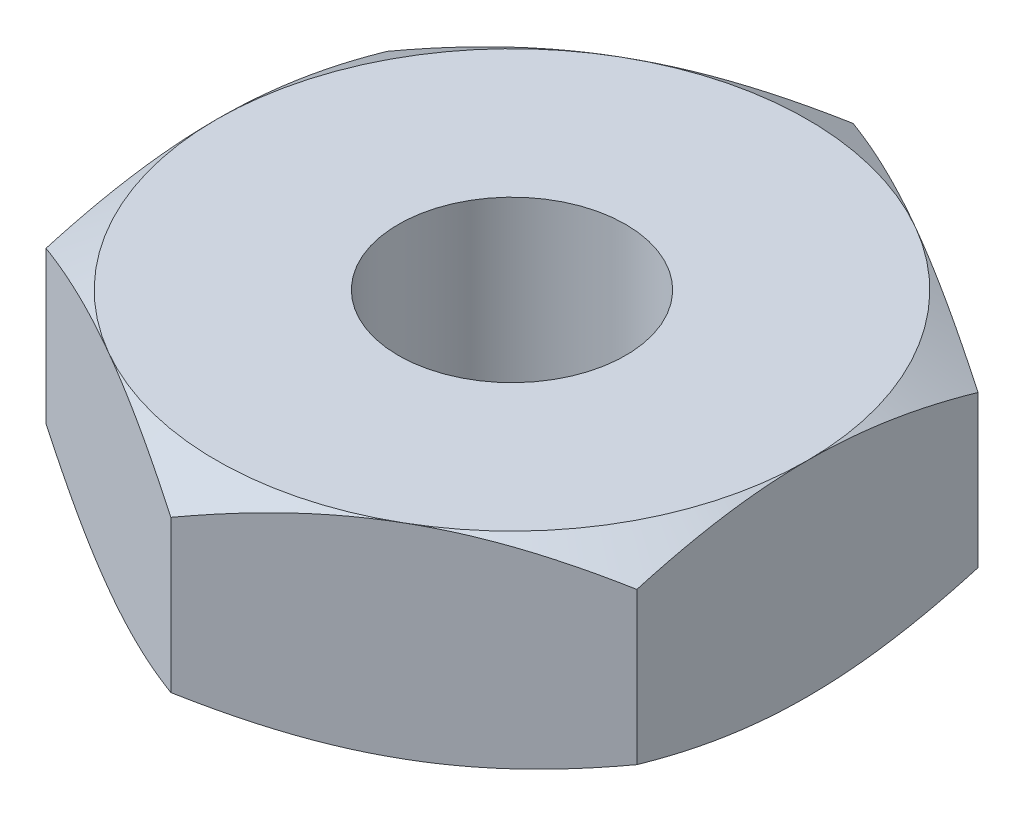
ISO-10303-21;
HEADER;
FILE_DESCRIPTION(('STEP AP214'),'2;1');
FILE_NAME('part.step','',(''),(''),'','','');
FILE_SCHEMA(('AUTOMOTIVE_DESIGN { 1 0 10303 214 1 1 1 1 }'));
ENDSEC;
DATA;
#1=APPLICATION_CONTEXT('core data for automotive mechanical design processes');
#2=APPLICATION_PROTOCOL_DEFINITION('international standard','automotive_design',2000,#1);
#3=PRODUCT_CONTEXT('',#1,'mechanical');
#4=PRODUCT('Part','Part','',(#3));
#5=PRODUCT_RELATED_PRODUCT_CATEGORY('part','',(#4));
#6=PRODUCT_DEFINITION_FORMATION('','',#4);
#7=PRODUCT_DEFINITION_CONTEXT('part definition',#1,'design');
#8=PRODUCT_DEFINITION('design','',#6,#7);
#9=PRODUCT_DEFINITION_SHAPE('','',#8);
#10=(LENGTH_UNIT() NAMED_UNIT(*) SI_UNIT(.MILLI.,.METRE.));
#11=(NAMED_UNIT(*) PLANE_ANGLE_UNIT() SI_UNIT($,.RADIAN.));
#12=(NAMED_UNIT(*) SI_UNIT($,.STERADIAN.) SOLID_ANGLE_UNIT());
#13=UNCERTAINTY_MEASURE_WITH_UNIT(LENGTH_MEASURE(1.E-05),#10,'distance_accuracy_value','');
#14=(GEOMETRIC_REPRESENTATION_CONTEXT(3) GLOBAL_UNCERTAINTY_ASSIGNED_CONTEXT((#13)) GLOBAL_UNIT_ASSIGNED_CONTEXT((#10,
#11,#12)) REPRESENTATION_CONTEXT('',''));
#15=CARTESIAN_POINT('',(0.,0.,0.));
#16=DIRECTION('',(0.,0.,1.));
#17=DIRECTION('',(1.,0.,0.));
#18=AXIS2_PLACEMENT_3D('',#15,#16,#17);
#19=CARTESIAN_POINT('',(0.,0.,0.));
#20=DIRECTION('',(0.,1.,0.));
#21=DIRECTION('',(0.,0.,1.));
#22=AXIS2_PLACEMENT_3D('',#19,#20,#21);
#23=PLANE('',#22);
#24=CARTESIAN_POINT('',(0.,0.,0.));
#25=DIRECTION('',(0.,1.,0.));
#26=DIRECTION('',(0.,0.,1.));
#27=AXIS2_PLACEMENT_3D('',#24,#25,#26);
#28=CIRCLE('',#27,0.625);
#29=CARTESIAN_POINT('',(0.,0.,0.625));
#30=VERTEX_POINT('',#29);
#31=EDGE_CURVE('E277',#30,#30,#28,.T.);
#32=ORIENTED_EDGE('',*,*,#31,.T.);
#33=EDGE_LOOP('',(#32));
#34=FACE_BOUND('',#33,.T.);
#35=CARTESIAN_POINT('',(0.,0.,0.));
#36=DIRECTION('',(0.,1.,0.));
#37=DIRECTION('',(0.,0.,1.));
#38=AXIS2_PLACEMENT_3D('',#35,#36,#37);
#39=CIRCLE('',#38,1.625);
#40=CARTESIAN_POINT('',(0.8125,0.,1.40729128114971));
#41=VERTEX_POINT('',#40);
#42=CARTESIAN_POINT('',(-0.8125,0.,1.40729128114971));
#43=VERTEX_POINT('',#42);
#44=EDGE_CURVE('E52',#41,#43,#39,.F.);
#45=ORIENTED_EDGE('',*,*,#44,.T.);
#46=CARTESIAN_POINT('',(-1.625,0.,0.));
#47=VERTEX_POINT('',#46);
#48=EDGE_CURVE('E12',#43,#47,#39,.F.);
#49=ORIENTED_EDGE('',*,*,#48,.T.);
#50=CARTESIAN_POINT('',(-0.8125,0.,-1.40729128114971));
#51=VERTEX_POINT('',#50);
#52=EDGE_CURVE('E58',#47,#51,#39,.F.);
#53=ORIENTED_EDGE('',*,*,#52,.T.);
#54=CARTESIAN_POINT('',(0.8125,0.,-1.40729128114971));
#55=VERTEX_POINT('',#54);
#56=EDGE_CURVE('E398',#51,#55,#39,.F.);
#57=ORIENTED_EDGE('',*,*,#56,.T.);
#58=CARTESIAN_POINT('',(1.625,0.,0.));
#59=VERTEX_POINT('',#58);
#60=EDGE_CURVE('E161',#55,#59,#39,.F.);
#61=ORIENTED_EDGE('',*,*,#60,.T.);
#62=CARTESIAN_POINT('',(0.,0.,0.));
#63=DIRECTION('',(0.,1.,0.));
#64=DIRECTION('',(0.,0.,1.));
#65=AXIS2_PLACEMENT_3D('',#62,#63,#64);
#66=CIRCLE('',#65,1.625);
#67=EDGE_CURVE('E142',#41,#59,#66,.T.);
#68=ORIENTED_EDGE('',*,*,#67,.F.);
#69=EDGE_LOOP('',(#45,#49,#53,#57,#61,#68));
#70=FACE_BOUND('',#69,.T.);
#71=ADVANCED_FACE('F47',(#34,#70),#23,.F.);
#72=CARTESIAN_POINT('',(0.,1.125,0.));
#73=DIRECTION('',(0.,1.,0.));
#74=DIRECTION('',(0.,0.,1.));
#75=AXIS2_PLACEMENT_3D('',#72,#73,#74);
#76=PLANE('',#75);
#77=CARTESIAN_POINT('',(0.,1.125,0.));
#78=DIRECTION('',(0.,1.,0.));
#79=DIRECTION('',(0.,0.,1.));
#80=AXIS2_PLACEMENT_3D('',#77,#78,#79);
#81=CIRCLE('',#80,0.625);
#82=CARTESIAN_POINT('',(0.,1.125,0.625));
#83=VERTEX_POINT('',#82);
#84=EDGE_CURVE('E272',#83,#83,#81,.T.);
#85=ORIENTED_EDGE('',*,*,#84,.F.);
#86=EDGE_LOOP('',(#85));
#87=FACE_BOUND('',#86,.T.);
#88=CARTESIAN_POINT('',(0.,1.125,0.));
#89=DIRECTION('',(0.,1.,0.));
#90=DIRECTION('',(0.,0.,1.));
#91=AXIS2_PLACEMENT_3D('',#88,#89,#90);
#92=CIRCLE('',#91,1.625);
#93=CARTESIAN_POINT('',(-0.8125,1.125,1.40729128114971));
#94=VERTEX_POINT('',#93);
#95=CARTESIAN_POINT('',(0.8125,1.125,1.40729128114971));
#96=VERTEX_POINT('',#95);
#97=EDGE_CURVE('E334',#94,#96,#92,.T.);
#98=ORIENTED_EDGE('',*,*,#97,.T.);
#99=CARTESIAN_POINT('',(1.625,1.125,0.));
#100=VERTEX_POINT('',#99);
#101=EDGE_CURVE('E337',#96,#100,#92,.T.);
#102=ORIENTED_EDGE('',*,*,#101,.T.);
#103=CARTESIAN_POINT('',(0.8125,1.125,-1.40729128114971));
#104=VERTEX_POINT('',#103);
#105=EDGE_CURVE('E349',#100,#104,#92,.T.);
#106=ORIENTED_EDGE('',*,*,#105,.T.);
#107=CARTESIAN_POINT('',(-0.8125,1.125,-1.40729128114971));
#108=VERTEX_POINT('',#107);
#109=EDGE_CURVE('E353',#104,#108,#92,.T.);
#110=ORIENTED_EDGE('',*,*,#109,.T.);
#111=CARTESIAN_POINT('',(-1.625,1.125,0.));
#112=VERTEX_POINT('',#111);
#113=EDGE_CURVE('E346',#108,#112,#92,.T.);
#114=ORIENTED_EDGE('',*,*,#113,.T.);
#115=EDGE_CURVE('E339',#112,#94,#92,.T.);
#116=ORIENTED_EDGE('',*,*,#115,.T.);
#117=EDGE_LOOP('',(#98,#102,#106,#110,#114,#116));
#118=FACE_BOUND('',#117,.T.);
#119=ADVANCED_FACE('F315',(#87,#118),#76,.T.);
#120=CARTESIAN_POINT('',(1.625,1.125,-0.938194187433143));
#121=DIRECTION('',(-0.5,0.,0.866025403784439));
#122=DIRECTION('',(0.866025403784439,0.,0.5));
#123=AXIS2_PLACEMENT_3D('',#120,#121,#122);
#124=PLANE('',#123);
#125=DIRECTION('',(0.,-1.,0.));
#126=VECTOR('',#125,1.);
#127=CARTESIAN_POINT('',(1.625,1.125,-0.938194187433143));
#128=LINE('',#127,#126);
#129=CARTESIAN_POINT('',(1.625,0.979860854099818,-0.938194187433157));
#130=VERTEX_POINT('',#129);
#131=CARTESIAN_POINT('',(1.625,0.145139145900191,-0.938194187433143));
#132=VERTEX_POINT('',#131);
#133=EDGE_CURVE('E276',#130,#132,#128,.T.);
#134=ORIENTED_EDGE('',*,*,#133,.T.);
#135=CARTESIAN_POINT('',(1.6252,0.145205818720325,-0.938078717379305));
#136=CARTESIAN_POINT('',(1.55378771595345,0.121390473504635,-0.979308618797024));
#137=CARTESIAN_POINT('',(1.48175900955025,0.0997308271575509,-1.02089441182829));
#138=CARTESIAN_POINT('',(1.33645419277129,0.0619226455424675,-1.10478618691018));
#139=CARTESIAN_POINT('',(1.2631754994124,0.045787487236339,-1.14709366024679));
#140=CARTESIAN_POINT('',(1.1175263201883,0.0206693238868447,-1.23118425307907));
#141=CARTESIAN_POINT('',(1.04517825178289,0.0115191685824773,-1.27295442984829));
#142=CARTESIAN_POINT('',(0.900141474302885,0.00059329568514964,-1.35669145236877));
#143=CARTESIAN_POINT('',(0.827453292840536,-0.00119146683762451,-1.39865799350296));
#144=CARTESIAN_POINT('',(0.691616862781737,0.00250991156481903,-1.47708319296316));
#145=CARTESIAN_POINT('',(0.628448340054166,0.00708723505630488,-1.51355355656424));
#146=CARTESIAN_POINT('',(0.502522861737482,0.0215982523845248,-1.58625666536821));
#147=CARTESIAN_POINT('',(0.439766342109185,0.0315369092164139,-1.62248915886901));
#148=CARTESIAN_POINT('',(0.313580964891704,0.0563841941738894,-1.69534232037332));
#149=CARTESIAN_POINT('',(0.250168088329588,0.0713982103650809,-1.73195376172654));
#150=CARTESIAN_POINT('',(0.124288441048471,0.105474664674621,-1.80463040996979));
#151=CARTESIAN_POINT('',(0.0618200560476715,0.124529089463915,-1.84069654886584));
#152=CARTESIAN_POINT('',(-0.000200000000000055,0.145205818720324,-1.87650384492012));
#153=B_SPLINE_CURVE_WITH_KNOTS('',3,(#135,#136,#137,#138,#139,#140,#141,#142,#143,#144,#145,
#146,#147,#148,#149,#150,#151,#152),.UNSPECIFIED.,.F.,.F.,(4,2,2,2,2,2,2,2,4),(0.,
0.257591322785538,0.51580203617469,0.767621292271709,1.01913121435468,1.23817526443927,
1.45742243279796,1.68153460667234,1.90520638880478),.UNSPECIFIED.);
#154=EDGE_CURVE('E71',#132,#55,#153,.T.);
#155=ORIENTED_EDGE('',*,*,#154,.T.);
#156=CARTESIAN_POINT('',(0.,0.145139145900191,-1.87638837486628));
#157=VERTEX_POINT('',#156);
#158=EDGE_CURVE('E206',#55,#157,#153,.T.);
#159=ORIENTED_EDGE('',*,*,#158,.T.);
#160=DIRECTION('',(0.,-1.,0.));
#161=VECTOR('',#160,1.);
#162=CARTESIAN_POINT('',(0.,1.125,-1.87638837486628));
#163=LINE('',#162,#161);
#164=CARTESIAN_POINT('',(0.,0.979860854099809,-1.87638837486628));
#165=VERTEX_POINT('',#164);
#166=EDGE_CURVE('E297',#165,#157,#163,.T.);
#167=ORIENTED_EDGE('',*,*,#166,.F.);
#168=CARTESIAN_POINT('',(1.6252,0.979794181279675,-0.938078717379305));
#169=CARTESIAN_POINT('',(1.55378771595345,1.00360952649537,-0.979308618797024));
#170=CARTESIAN_POINT('',(1.48175900955025,1.02526917284245,-1.02089441182829));
#171=CARTESIAN_POINT('',(1.33645419277129,1.06307735445753,-1.10478618691017));
#172=CARTESIAN_POINT('',(1.2631754994124,1.07921251276366,-1.14709366024679));
#173=CARTESIAN_POINT('',(1.1175263201883,1.10433067611316,-1.23118425307907));
#174=CARTESIAN_POINT('',(1.04517825178289,1.11348083141752,-1.27295442984829));
#175=CARTESIAN_POINT('',(0.900141474302885,1.12440670431485,-1.35669145236877));
#176=CARTESIAN_POINT('',(0.827453292840536,1.12619146683762,-1.39865799350296));
#177=CARTESIAN_POINT('',(0.691616862781737,1.12249008843518,-1.47708319296316));
#178=CARTESIAN_POINT('',(0.628448340054166,1.1179127649437,-1.51355355656424));
#179=CARTESIAN_POINT('',(0.502522861737482,1.10340174761548,-1.58625666536821));
#180=CARTESIAN_POINT('',(0.439766342109185,1.09346309078359,-1.62248915886901));
#181=CARTESIAN_POINT('',(0.313580964891704,1.06861580582611,-1.69534232037332));
#182=CARTESIAN_POINT('',(0.250168088329588,1.05360178963492,-1.73195376172654));
#183=CARTESIAN_POINT('',(0.124288441048471,1.01952533532538,-1.80463040996979));
#184=CARTESIAN_POINT('',(0.0618200560476713,1.00047091053609,-1.84069654886584));
#185=CARTESIAN_POINT('',(-0.000200000000000058,0.979794181279676,-1.87650384492012));
#186=B_SPLINE_CURVE_WITH_KNOTS('',3,(#168,#169,#170,#171,#172,#173,#174,#175,#176,#177,#178,
#179,#180,#181,#182,#183,#184,#185),.UNSPECIFIED.,.F.,.F.,(4,2,2,2,2,2,2,2,4),(0.,
0.257591322785538,0.51580203617469,0.767621292271709,1.01913121435468,1.23817526443926,
1.45742243279796,1.68153460667234,1.90520638880478),.UNSPECIFIED.);
#187=EDGE_CURVE('E264',#104,#165,#186,.T.);
#188=ORIENTED_EDGE('',*,*,#187,.F.);
#189=EDGE_CURVE('E271',#130,#104,#186,.T.);
#190=ORIENTED_EDGE('',*,*,#189,.F.);
#191=EDGE_LOOP('',(#134,#155,#159,#167,#188,#190));
#192=FACE_BOUND('',#191,.T.);
#193=ADVANCED_FACE('F49',(#192),#124,.F.);
#194=CARTESIAN_POINT('',(0.,1.125,-1.87638837486628));
#195=DIRECTION('',(0.5,0.,0.866025403784439));
#196=DIRECTION('',(0.866025403784439,0.,-0.5));
#197=AXIS2_PLACEMENT_3D('',#194,#195,#196);
#198=PLANE('',#197);
#199=ORIENTED_EDGE('',*,*,#166,.T.);
#200=CARTESIAN_POINT('',(0.000199999999999966,0.145205818720325,-1.87650384492012));
#201=CARTESIAN_POINT('',(-0.0712122840465463,0.121390473504635,-1.8352739435024));
#202=CARTESIAN_POINT('',(-0.14324099044975,0.099730827157551,-1.79368815047113));
#203=CARTESIAN_POINT('',(-0.288545807228708,0.0619226455424676,-1.70979637538925));
#204=CARTESIAN_POINT('',(-0.361824500587597,0.045787487236339,-1.66748890205263));
#205=CARTESIAN_POINT('',(-0.507473679811694,0.0206693238868447,-1.58339830922035));
#206=CARTESIAN_POINT('',(-0.579821748217106,0.0115191685824773,-1.54162813245114));
#207=CARTESIAN_POINT('',(-0.724858525697114,0.000593295685149696,-1.45789110993066));
#208=CARTESIAN_POINT('',(-0.797546707159463,-0.00119146683762443,-1.41592456879647));
#209=CARTESIAN_POINT('',(-0.933383137218262,0.0025099115648189,-1.33749936933626));
#210=CARTESIAN_POINT('',(-0.996551659945833,0.00708723505630456,-1.30102900573519));
#211=CARTESIAN_POINT('',(-1.12247713826252,0.0215982523845245,-1.22832589693122));
#212=CARTESIAN_POINT('',(-1.18523365789081,0.0315369092164138,-1.19209340343042));
#213=CARTESIAN_POINT('',(-1.3114190351083,0.0563841941738893,-1.11924024192611));
#214=CARTESIAN_POINT('',(-1.37483191167041,0.0713982103650808,-1.08262880057288));
#215=CARTESIAN_POINT('',(-1.50071155895153,0.105474664674621,-1.00995215232964));
#216=CARTESIAN_POINT('',(-1.56317994395233,0.124529089463915,-0.973886013433583));
#217=CARTESIAN_POINT('',(-1.6252,0.145205818720325,-0.938078717379304));
#218=B_SPLINE_CURVE_WITH_KNOTS('',3,(#200,#201,#202,#203,#204,#205,#206,#207,#208,#209,#210,
#211,#212,#213,#214,#215,#216,#217),.UNSPECIFIED.,.F.,.F.,(4,2,2,2,2,2,2,2,4),(0.,
0.257591322785538,0.51580203617469,0.767621292271709,1.01913121435468,1.23817526443927,
1.45742243279796,1.68153460667234,1.90520638880478),.UNSPECIFIED.);
#219=EDGE_CURVE('E404',#157,#51,#218,.T.);
#220=ORIENTED_EDGE('',*,*,#219,.T.);
#221=CARTESIAN_POINT('',(-1.625,0.145139145900191,-0.938194187433142));
#222=VERTEX_POINT('',#221);
#223=EDGE_CURVE('E225',#51,#222,#218,.T.);
#224=ORIENTED_EDGE('',*,*,#223,.T.);
#225=DIRECTION('',(0.,-1.,0.));
#226=VECTOR('',#225,1.);
#227=CARTESIAN_POINT('',(-1.625,1.125,-0.938194187433142));
#228=LINE('',#227,#226);
#229=CARTESIAN_POINT('',(-1.625,0.979860854099809,-0.938194187433142));
#230=VERTEX_POINT('',#229);
#231=EDGE_CURVE('E293',#230,#222,#228,.T.);
#232=ORIENTED_EDGE('',*,*,#231,.F.);
#233=CARTESIAN_POINT('',(0.000199999999999945,0.979794181279675,-1.87650384492012));
#234=CARTESIAN_POINT('',(-0.0712122840465462,1.00360952649537,-1.8352739435024));
#235=CARTESIAN_POINT('',(-0.14324099044975,1.02526917284245,-1.79368815047113));
#236=CARTESIAN_POINT('',(-0.288545807228708,1.06307735445753,-1.70979637538925));
#237=CARTESIAN_POINT('',(-0.361824500587597,1.07921251276366,-1.66748890205263));
#238=CARTESIAN_POINT('',(-0.507473679811694,1.10433067611316,-1.58339830922035));
#239=CARTESIAN_POINT('',(-0.579821748217106,1.11348083141752,-1.54162813245114));
#240=CARTESIAN_POINT('',(-0.724858525697115,1.12440670431485,-1.45789110993066));
#241=CARTESIAN_POINT('',(-0.797546707159463,1.12619146683762,-1.41592456879647));
#242=CARTESIAN_POINT('',(-0.933383137218262,1.12249008843518,-1.33749936933626));
#243=CARTESIAN_POINT('',(-0.996551659945833,1.1179127649437,-1.30102900573519));
#244=CARTESIAN_POINT('',(-1.12247713826252,1.10340174761548,-1.22832589693122));
#245=CARTESIAN_POINT('',(-1.18523365789081,1.09346309078359,-1.19209340343042));
#246=CARTESIAN_POINT('',(-1.3114190351083,1.06861580582611,-1.11924024192611));
#247=CARTESIAN_POINT('',(-1.37483191167041,1.05360178963492,-1.08262880057288));
#248=CARTESIAN_POINT('',(-1.50071155895153,1.01952533532538,-1.00995215232964));
#249=CARTESIAN_POINT('',(-1.56317994395233,1.00047091053609,-0.973886013433583));
#250=CARTESIAN_POINT('',(-1.6252,0.979794181279675,-0.938078717379304));
#251=B_SPLINE_CURVE_WITH_KNOTS('',3,(#233,#234,#235,#236,#237,#238,#239,#240,#241,#242,#243,
#244,#245,#246,#247,#248,#249,#250),.UNSPECIFIED.,.F.,.F.,(4,2,2,2,2,2,2,2,4),(0.,
0.257591322785538,0.51580203617469,0.767621292271709,1.01913121435468,1.23817526443927,
1.45742243279796,1.68153460667234,1.90520638880478),.UNSPECIFIED.);
#252=EDGE_CURVE('E256',#108,#230,#251,.T.);
#253=ORIENTED_EDGE('',*,*,#252,.F.);
#254=EDGE_CURVE('E263',#165,#108,#251,.T.);
#255=ORIENTED_EDGE('',*,*,#254,.F.);
#256=EDGE_LOOP('',(#199,#220,#224,#232,#253,#255));
#257=FACE_BOUND('',#256,.T.);
#258=ADVANCED_FACE('F234',(#257),#198,.F.);
#259=CARTESIAN_POINT('',(-1.625,1.125,-0.938194187433142));
#260=DIRECTION('',(1.,0.,0.));
#261=DIRECTION('',(0.,0.,-1.));
#262=AXIS2_PLACEMENT_3D('',#259,#260,#261);
#263=PLANE('',#262);
#264=ORIENTED_EDGE('',*,*,#231,.T.);
#265=CARTESIAN_POINT('',(-1.625,1.0959887021106,-3.12619178623732));
#266=CARTESIAN_POINT('',(-1.625,1.05853229976619,-3.05306721238208));
#267=CARTESIAN_POINT('',(-1.625,1.02129111592867,-2.97983175345087));
#268=CARTESIAN_POINT('',(-1.625,0.947341748298043,-2.83309048823557));
#269=CARTESIAN_POINT('',(-1.625,0.910633575523673,-2.75958467640183));
#270=CARTESIAN_POINT('',(-1.625,0.801341943620138,-2.53834481078385));
#271=CARTESIAN_POINT('',(-1.625,0.729718464894796,-2.39013475916787));
#272=CARTESIAN_POINT('',(-1.625,0.58672552546677,-2.08424393526228));
#273=CARTESIAN_POINT('',(-1.625,0.515557583509718,-1.92646735552007));
#274=CARTESIAN_POINT('',(-1.625,0.414061483840219,-1.68760729753375));
#275=CARTESIAN_POINT('',(-1.625,0.381113004891505,-1.60764169129142));
#276=CARTESIAN_POINT('',(-1.625,0.31751606697927,-1.44680499363012));
#277=CARTESIAN_POINT('',(-1.625,0.28686737850051,-1.36593399349612));
#278=CARTESIAN_POINT('',(-1.625,0.223475019823102,-1.18888067338318));
#279=CARTESIAN_POINT('',(-1.625,0.19130061580442,-1.0924914437709));
#280=CARTESIAN_POINT('',(-1.625,0.132659618898764,-0.898011513007609));
#281=CARTESIAN_POINT('',(-1.625,0.106190041496423,-0.799921730674278));
#282=CARTESIAN_POINT('',(-1.625,0.0613481396711577,-0.603791564893918));
#283=CARTESIAN_POINT('',(-1.625,0.0428333394386332,-0.505784718471478));
#284=CARTESIAN_POINT('',(-1.625,0.0151602161536154,-0.308463646748248));
#285=CARTESIAN_POINT('',(-1.625,0.00599657157381989,-0.209150197637119));
#286=CARTESIAN_POINT('',(-1.625,-0.00177859381226553,-0.0088904859787609));
#287=CARTESIAN_POINT('',(-1.625,-0.000261546907477821,0.0920610254698287));
#288=CARTESIAN_POINT('',(-1.625,0.0134023828209619,0.29324656515621));
#289=CARTESIAN_POINT('',(-1.625,0.0255533549139771,0.39348030242332));
#290=CARTESIAN_POINT('',(-1.625,0.0592056489698971,0.594346604582949));
#291=CARTESIAN_POINT('',(-1.625,0.0808871567505061,0.694947846039199));
#292=CARTESIAN_POINT('',(-1.625,0.131441122456543,0.894300968269611));
#293=CARTESIAN_POINT('',(-1.625,0.160315353916685,0.993052386459833));
#294=CARTESIAN_POINT('',(-1.625,0.221061000980684,1.18181292867012));
#295=CARTESIAN_POINT('',(-1.625,0.252569131567159,1.27194124472905));
#296=CARTESIAN_POINT('',(-1.625,0.318946017746448,1.45096069837542));
#297=CARTESIAN_POINT('',(-1.625,0.353815469010963,1.5398515754825));
#298=CARTESIAN_POINT('',(-1.625,0.426080831108988,1.71668720371283));
#299=CARTESIAN_POINT('',(-1.625,0.463479023403759,1.80463101518443));
#300=CARTESIAN_POINT('',(-1.625,0.540157296673894,1.97969544147325));
#301=CARTESIAN_POINT('',(-1.625,0.579437471414613,2.06681601501512));
#302=CARTESIAN_POINT('',(-1.625,0.657272476523296,2.23570090537208));
#303=CARTESIAN_POINT('',(-1.625,0.695751735721113,2.31750018726129));
#304=CARTESIAN_POINT('',(-1.625,0.77372397850941,2.4806160585329));
#305=CARTESIAN_POINT('',(-1.625,0.813216991492225,2.56193263383556));
#306=CARTESIAN_POINT('',(-1.625,0.892890367787533,2.72392841653462));
#307=CARTESIAN_POINT('',(-1.625,0.933068348528742,2.80460879841367));
#308=CARTESIAN_POINT('',(-1.625,1.01407573011298,2.96563394118475));
#309=CARTESIAN_POINT('',(-1.625,1.05490507806146,3.045978728667));
#310=CARTESIAN_POINT('',(-1.625,1.0959887021106,3.12619178623732));
#311=B_SPLINE_CURVE_WITH_KNOTS('',3,(#265,#266,#267,#268,#269,#270,#271,#272,#273,#274,#275,
#276,#277,#278,#279,#280,#281,#282,#283,#284,#285,#286,#287,#288,#289,#290,#291,#292,#293,#294,
#295,#296,#297,#298,#299,#300,#301,#302,#303,#304,#305,#306,#307,#308,#309,#310),.UNSPECIFIED.,
.F.,.F.,(4,2,2,2,2,2,2,2,2,2,2,2,2,2,2,2,2,2,2,2,2,2,4),(0.,0.246478889892066,0.492962867917289,
0.986762542894692,1.50589393519365,1.76532986714203,2.02473987328832,2.32946455353436,
2.63402942611415,2.93288550660795,3.23157141998626,3.53385882853169,3.83626253261756,
4.14464743917656,4.45310846066424,4.73945508859373,5.02586110766992,5.31252906548015,
5.59921132073056,5.87039654107322,6.14158963294247,6.41197940675875,6.68234733411079),.UNSPECIFIED.);
#312=EDGE_CURVE('E224',#222,#47,#311,.T.);
#313=ORIENTED_EDGE('',*,*,#312,.T.);
#314=CARTESIAN_POINT('',(-1.625,0.145139145900191,0.938194187433142));
#315=VERTEX_POINT('',#314);
#316=EDGE_CURVE('E216',#47,#315,#311,.T.);
#317=ORIENTED_EDGE('',*,*,#316,.T.);
#318=DIRECTION('',(0.,-1.,0.));
#319=VECTOR('',#318,1.);
#320=CARTESIAN_POINT('',(-1.625,1.125,0.938194187433142));
#321=LINE('',#320,#319);
#322=CARTESIAN_POINT('',(-1.625,0.979860854099809,0.938194187433142));
#323=VERTEX_POINT('',#322);
#324=EDGE_CURVE('E289',#323,#315,#321,.T.);
#325=ORIENTED_EDGE('',*,*,#324,.F.);
#326=CARTESIAN_POINT('',(-1.625,0.0290112978893965,-3.12619178623732));
#327=CARTESIAN_POINT('',(-1.625,0.0664677002338145,-3.05306721238208));
#328=CARTESIAN_POINT('',(-1.625,0.103708884071331,-2.97983175345087));
#329=CARTESIAN_POINT('',(-1.625,0.177658251701957,-2.83309048823557));
#330=CARTESIAN_POINT('',(-1.625,0.214366424476327,-2.75958467640183));
#331=CARTESIAN_POINT('',(-1.625,0.323658056379862,-2.53834481078385));
#332=CARTESIAN_POINT('',(-1.625,0.395281535105204,-2.39013475916787));
#333=CARTESIAN_POINT('',(-1.625,0.53827447453323,-2.08424393526228));
#334=CARTESIAN_POINT('',(-1.625,0.609442416490282,-1.92646735552007));
#335=CARTESIAN_POINT('',(-1.625,0.710938516159781,-1.68760729753375));
#336=CARTESIAN_POINT('',(-1.625,0.743886995108495,-1.60764169129142));
#337=CARTESIAN_POINT('',(-1.625,0.80748393302073,-1.44680499363012));
#338=CARTESIAN_POINT('',(-1.625,0.83813262149949,-1.36593399349612));
#339=CARTESIAN_POINT('',(-1.625,0.901524980176898,-1.18888067338318));
#340=CARTESIAN_POINT('',(-1.625,0.93369938419558,-1.0924914437709));
#341=CARTESIAN_POINT('',(-1.625,0.992340381101236,-0.89801151300761));
#342=CARTESIAN_POINT('',(-1.625,1.01880995850358,-0.799921730674278));
#343=CARTESIAN_POINT('',(-1.625,1.06365186032884,-0.603791564893918));
#344=CARTESIAN_POINT('',(-1.625,1.08216666056137,-0.505784718471478));
#345=CARTESIAN_POINT('',(-1.625,1.10983978384638,-0.308463646748248));
#346=CARTESIAN_POINT('',(-1.625,1.11900342842618,-0.209150197637119));
#347=CARTESIAN_POINT('',(-1.625,1.12677859381227,-0.00889048597876098));
#348=CARTESIAN_POINT('',(-1.625,1.12526154690748,0.0920610254698285));
#349=CARTESIAN_POINT('',(-1.625,1.11159761717904,0.29324656515621));
#350=CARTESIAN_POINT('',(-1.625,1.09944664508602,0.39348030242332));
#351=CARTESIAN_POINT('',(-1.625,1.0657943510301,0.594346604582949));
#352=CARTESIAN_POINT('',(-1.625,1.04411284324949,0.6949478460392));
#353=CARTESIAN_POINT('',(-1.625,0.993558877543457,0.894300968269611));
#354=CARTESIAN_POINT('',(-1.625,0.964684646083314,0.993052386459834));
#355=CARTESIAN_POINT('',(-1.625,0.903938999019316,1.18181292867012));
#356=CARTESIAN_POINT('',(-1.625,0.872430868432841,1.27194124472905));
#357=CARTESIAN_POINT('',(-1.625,0.806053982253552,1.45096069837542));
#358=CARTESIAN_POINT('',(-1.625,0.771184530989037,1.5398515754825));
#359=CARTESIAN_POINT('',(-1.625,0.698919168891012,1.71668720371283));
#360=CARTESIAN_POINT('',(-1.625,0.661520976596241,1.80463101518443));
#361=CARTESIAN_POINT('',(-1.625,0.584842703326106,1.97969544147325));
#362=CARTESIAN_POINT('',(-1.625,0.545562528585387,2.06681601501512));
#363=CARTESIAN_POINT('',(-1.625,0.467727523476704,2.23570090537208));
#364=CARTESIAN_POINT('',(-1.625,0.429248264278887,2.31750018726129));
#365=CARTESIAN_POINT('',(-1.625,0.35127602149059,2.4806160585329));
#366=CARTESIAN_POINT('',(-1.625,0.311783008507775,2.56193263383556));
#367=CARTESIAN_POINT('',(-1.625,0.232109632212467,2.72392841653462));
#368=CARTESIAN_POINT('',(-1.625,0.191931651471258,2.80460879841367));
#369=CARTESIAN_POINT('',(-1.625,0.110924269887022,2.96563394118475));
#370=CARTESIAN_POINT('',(-1.625,0.070094921938542,3.045978728667));
#371=CARTESIAN_POINT('',(-1.625,0.0290112978893966,3.12619178623732));
#372=B_SPLINE_CURVE_WITH_KNOTS('',3,(#326,#327,#328,#329,#330,#331,#332,#333,#334,#335,#336,
#337,#338,#339,#340,#341,#342,#343,#344,#345,#346,#347,#348,#349,#350,#351,#352,#353,#354,#355,
#356,#357,#358,#359,#360,#361,#362,#363,#364,#365,#366,#367,#368,#369,#370,#371),.UNSPECIFIED.,
.F.,.F.,(4,2,2,2,2,2,2,2,2,2,2,2,2,2,2,2,2,2,2,2,2,2,4),(0.,0.246478889892066,0.492962867917289,
0.986762542894692,1.50589393519365,1.76532986714203,2.02473987328832,2.32946455353436,
2.63402942611415,2.93288550660795,3.23157141998626,3.53385882853169,3.83626253261756,
4.14464743917656,4.45310846066424,4.73945508859373,5.02586110766992,5.31252906548015,
5.59921132073056,5.87039654107322,6.14158963294247,6.41197940675875,6.68234733411079),.UNSPECIFIED.);
#373=EDGE_CURVE('E240',#112,#323,#372,.T.);
#374=ORIENTED_EDGE('',*,*,#373,.F.);
#375=EDGE_CURVE('E248',#230,#112,#372,.T.);
#376=ORIENTED_EDGE('',*,*,#375,.F.);
#377=EDGE_LOOP('',(#264,#313,#317,#325,#374,#376));
#378=FACE_BOUND('',#377,.T.);
#379=ADVANCED_FACE('F230',(#378),#263,.F.);
#380=CARTESIAN_POINT('',(-1.625,1.125,0.938194187433142));
#381=DIRECTION('',(0.5,0.,-0.866025403784439));
#382=DIRECTION('',(-0.866025403784439,0.,-0.5));
#383=AXIS2_PLACEMENT_3D('',#380,#381,#382);
#384=PLANE('',#383);
#385=ORIENTED_EDGE('',*,*,#324,.T.);
#386=CARTESIAN_POINT('',(-1.6252,0.145205818720325,0.938078717379304));
#387=CARTESIAN_POINT('',(-1.55378771595345,0.121390473504635,0.979308618797024));
#388=CARTESIAN_POINT('',(-1.48175900955025,0.0997308271575509,1.02089441182829));
#389=CARTESIAN_POINT('',(-1.33645419277129,0.0619226455424675,1.10478618691017));
#390=CARTESIAN_POINT('',(-1.2631754994124,0.045787487236339,1.14709366024679));
#391=CARTESIAN_POINT('',(-1.11752632018831,0.0206693238868448,1.23118425307907));
#392=CARTESIAN_POINT('',(-1.04517825178289,0.0115191685824774,1.27295442984829));
#393=CARTESIAN_POINT('',(-0.900141474302885,0.000593295685149769,1.35669145236877));
#394=CARTESIAN_POINT('',(-0.827453292840537,-0.0011914668376244,1.39865799350296));
#395=CARTESIAN_POINT('',(-0.691616862781738,0.00250991156481904,1.47708319296316));
#396=CARTESIAN_POINT('',(-0.628448340054167,0.00708723505630482,1.51355355656424));
#397=CARTESIAN_POINT('',(-0.502522861737483,0.0215982523845247,1.58625666536821));
#398=CARTESIAN_POINT('',(-0.439766342109186,0.0315369092164139,1.62248915886901));
#399=CARTESIAN_POINT('',(-0.313580964891705,0.0563841941738894,1.69534232037332));
#400=CARTESIAN_POINT('',(-0.250168088329589,0.0713982103650809,1.73195376172654));
#401=CARTESIAN_POINT('',(-0.124288441048471,0.105474664674621,1.80463040996979));
#402=CARTESIAN_POINT('',(-0.0618200560476715,0.124529089463915,1.84069654886584));
#403=CARTESIAN_POINT('',(0.000199999999999958,0.145205818720325,1.87650384492012));
#404=B_SPLINE_CURVE_WITH_KNOTS('',3,(#386,#387,#388,#389,#390,#391,#392,#393,#394,#395,#396,
#397,#398,#399,#400,#401,#402,#403),.UNSPECIFIED.,.F.,.F.,(4,2,2,2,2,2,2,2,4),(0.,
0.257591322785537,0.515802036174689,0.767621292271709,1.01913121435468,1.23817526443927,
1.45742243279796,1.68153460667234,1.90520638880478),.UNSPECIFIED.);
#405=EDGE_CURVE('E174',#315,#43,#404,.T.);
#406=ORIENTED_EDGE('',*,*,#405,.T.);
#407=CARTESIAN_POINT('',(0.,0.145139145900191,1.87638837486628));
#408=VERTEX_POINT('',#407);
#409=EDGE_CURVE('E157',#43,#408,#404,.T.);
#410=ORIENTED_EDGE('',*,*,#409,.T.);
#411=DIRECTION('',(0.,-1.,0.));
#412=VECTOR('',#411,1.);
#413=CARTESIAN_POINT('',(0.,1.125,1.87638837486628));
#414=LINE('',#413,#412);
#415=CARTESIAN_POINT('',(0.,0.979860854099809,1.87638837486628));
#416=VERTEX_POINT('',#415);
#417=EDGE_CURVE('E171',#416,#408,#414,.T.);
#418=ORIENTED_EDGE('',*,*,#417,.F.);
#419=CARTESIAN_POINT('',(-1.6252,0.979794181279675,0.938078717379304));
#420=CARTESIAN_POINT('',(-1.55378771595345,1.00360952649537,0.979308618797024));
#421=CARTESIAN_POINT('',(-1.48175900955025,1.02526917284245,1.02089441182829));
#422=CARTESIAN_POINT('',(-1.33645419277129,1.06307735445753,1.10478618691017));
#423=CARTESIAN_POINT('',(-1.2631754994124,1.07921251276366,1.14709366024679));
#424=CARTESIAN_POINT('',(-1.11752632018831,1.10433067611316,1.23118425307907));
#425=CARTESIAN_POINT('',(-1.04517825178289,1.11348083141752,1.27295442984829));
#426=CARTESIAN_POINT('',(-0.900141474302885,1.12440670431485,1.35669145236877));
#427=CARTESIAN_POINT('',(-0.827453292840537,1.12619146683762,1.39865799350296));
#428=CARTESIAN_POINT('',(-0.691616862781737,1.12249008843518,1.47708319296316));
#429=CARTESIAN_POINT('',(-0.628448340054167,1.1179127649437,1.51355355656424));
#430=CARTESIAN_POINT('',(-0.502522861737482,1.10340174761548,1.58625666536821));
#431=CARTESIAN_POINT('',(-0.439766342109185,1.09346309078359,1.62248915886901));
#432=CARTESIAN_POINT('',(-0.313580964891704,1.06861580582611,1.69534232037332));
#433=CARTESIAN_POINT('',(-0.250168088329589,1.05360178963492,1.73195376172654));
#434=CARTESIAN_POINT('',(-0.124288441048471,1.01952533532538,1.80463040996979));
#435=CARTESIAN_POINT('',(-0.0618200560476714,1.00047091053609,1.84069654886584));
#436=CARTESIAN_POINT('',(0.000200000000000059,0.979794181279675,1.87650384492012));
#437=B_SPLINE_CURVE_WITH_KNOTS('',3,(#419,#420,#421,#422,#423,#424,#425,#426,#427,#428,#429,
#430,#431,#432,#433,#434,#435,#436),.UNSPECIFIED.,.F.,.F.,(4,2,2,2,2,2,2,2,4),(0.,
0.257591322785538,0.51580203617469,0.767621292271709,1.01913121435468,1.23817526443927,
1.45742243279796,1.68153460667234,1.90520638880478),.UNSPECIFIED.);
#438=EDGE_CURVE('E250',#94,#416,#437,.T.);
#439=ORIENTED_EDGE('',*,*,#438,.F.);
#440=EDGE_CURVE('E249',#323,#94,#437,.T.);
#441=ORIENTED_EDGE('',*,*,#440,.F.);
#442=EDGE_LOOP('',(#385,#406,#410,#418,#439,#441));
#443=FACE_BOUND('',#442,.T.);
#444=ADVANCED_FACE('F233',(#443),#384,.F.);
#445=CARTESIAN_POINT('',(0.,1.125,1.87638837486628));
#446=DIRECTION('',(-0.5,0.,-0.866025403784439));
#447=DIRECTION('',(-0.866025403784439,0.,0.5));
#448=AXIS2_PLACEMENT_3D('',#445,#446,#447);
#449=PLANE('',#448);
#450=ORIENTED_EDGE('',*,*,#417,.T.);
#451=CARTESIAN_POINT('',(-0.000199999999999869,0.145205818720325,1.87650384492012));
#452=CARTESIAN_POINT('',(0.0712122840465463,0.121390473504635,1.8352739435024));
#453=CARTESIAN_POINT('',(0.143240990449751,0.0997308271575511,1.79368815047113));
#454=CARTESIAN_POINT('',(0.288545807228708,0.0619226455424677,1.70979637538925));
#455=CARTESIAN_POINT('',(0.361824500587597,0.0457874872363391,1.66748890205263));
#456=CARTESIAN_POINT('',(0.507473679811695,0.0206693238868448,1.58339830922035));
#457=CARTESIAN_POINT('',(0.579821748217106,0.0115191685824774,1.54162813245114));
#458=CARTESIAN_POINT('',(0.724858525697115,0.000593295685149801,1.45789110993066));
#459=CARTESIAN_POINT('',(0.797546707159463,-0.00119146683762431,1.41592456879647));
#460=CARTESIAN_POINT('',(0.933383137218262,0.00250991156481908,1.33749936933626));
#461=CARTESIAN_POINT('',(0.996551659945833,0.00708723505630477,1.30102900573519));
#462=CARTESIAN_POINT('',(1.12247713826252,0.0215982523845247,1.22832589693122));
#463=CARTESIAN_POINT('',(1.18523365789081,0.0315369092164139,1.19209340343042));
#464=CARTESIAN_POINT('',(1.3114190351083,0.0563841941738894,1.11924024192611));
#465=CARTESIAN_POINT('',(1.37483191167041,0.0713982103650809,1.08262880057288));
#466=CARTESIAN_POINT('',(1.50071155895153,0.105474664674621,1.00995215232964));
#467=CARTESIAN_POINT('',(1.56317994395233,0.124529089463915,0.973886013433583));
#468=CARTESIAN_POINT('',(1.6252,0.145205818720325,0.938078717379304));
#469=B_SPLINE_CURVE_WITH_KNOTS('',3,(#451,#452,#453,#454,#455,#456,#457,#458,#459,#460,#461,
#462,#463,#464,#465,#466,#467,#468),.UNSPECIFIED.,.F.,.F.,(4,2,2,2,2,2,2,2,4),(0.,
0.257591322785538,0.51580203617469,0.767621292271709,1.01913121435468,1.23817526443927,
1.45742243279796,1.68153460667234,1.90520638880478),.UNSPECIFIED.);
#470=EDGE_CURVE('E151',#408,#41,#469,.T.);
#471=ORIENTED_EDGE('',*,*,#470,.T.);
#472=CARTESIAN_POINT('',(1.625,0.145139145900191,0.938194187433142));
#473=VERTEX_POINT('',#472);
#474=EDGE_CURVE('E138',#41,#473,#469,.T.);
#475=ORIENTED_EDGE('',*,*,#474,.T.);
#476=DIRECTION('',(0.,-1.,0.));
#477=VECTOR('',#476,1.);
#478=CARTESIAN_POINT('',(1.625,1.125,0.938194187433142));
#479=LINE('',#478,#477);
#480=CARTESIAN_POINT('',(1.625,0.979860854099809,0.938194187433142));
#481=VERTEX_POINT('',#480);
#482=EDGE_CURVE('E284',#481,#473,#479,.T.);
#483=ORIENTED_EDGE('',*,*,#482,.F.);
#484=CARTESIAN_POINT('',(-0.000199999999999876,0.979794181279675,1.87650384492012));
#485=CARTESIAN_POINT('',(0.0712122840465462,1.00360952649536,1.8352739435024));
#486=CARTESIAN_POINT('',(0.143240990449751,1.02526917284245,1.79368815047113));
#487=CARTESIAN_POINT('',(0.288545807228708,1.06307735445753,1.70979637538925));
#488=CARTESIAN_POINT('',(0.361824500587597,1.07921251276366,1.66748890205263));
#489=CARTESIAN_POINT('',(0.507473679811695,1.10433067611316,1.58339830922035));
#490=CARTESIAN_POINT('',(0.579821748217106,1.11348083141752,1.54162813245114));
#491=CARTESIAN_POINT('',(0.724858525697115,1.12440670431485,1.45789110993066));
#492=CARTESIAN_POINT('',(0.797546707159463,1.12619146683762,1.41592456879647));
#493=CARTESIAN_POINT('',(0.933383137218262,1.12249008843518,1.33749936933626));
#494=CARTESIAN_POINT('',(0.996551659945833,1.1179127649437,1.30102900573519));
#495=CARTESIAN_POINT('',(1.12247713826252,1.10340174761548,1.22832589693122));
#496=CARTESIAN_POINT('',(1.18523365789081,1.09346309078359,1.19209340343042));
#497=CARTESIAN_POINT('',(1.3114190351083,1.06861580582611,1.11924024192611));
#498=CARTESIAN_POINT('',(1.37483191167041,1.05360178963492,1.08262880057288));
#499=CARTESIAN_POINT('',(1.50071155895153,1.01952533532538,1.00995215232964));
#500=CARTESIAN_POINT('',(1.56317994395233,1.00047091053609,0.973886013433583));
#501=CARTESIAN_POINT('',(1.6252,0.979794181279675,0.938078717379304));
#502=B_SPLINE_CURVE_WITH_KNOTS('',3,(#484,#485,#486,#487,#488,#489,#490,#491,#492,#493,#494,
#495,#496,#497,#498,#499,#500,#501),.UNSPECIFIED.,.F.,.F.,(4,2,2,2,2,2,2,2,4),(0.,
0.257591322785538,0.51580203617469,0.767621292271709,1.01913121435468,1.23817526443927,
1.45742243279796,1.68153460667234,1.90520638880478),.UNSPECIFIED.);
#503=EDGE_CURVE('E348',#96,#481,#502,.T.);
#504=ORIENTED_EDGE('',*,*,#503,.F.);
#505=EDGE_CURVE('E352',#416,#96,#502,.T.);
#506=ORIENTED_EDGE('',*,*,#505,.F.);
#507=EDGE_LOOP('',(#450,#471,#475,#483,#504,#506));
#508=FACE_BOUND('',#507,.T.);
#509=ADVANCED_FACE('F168',(#508),#449,.F.);
#510=CARTESIAN_POINT('',(1.625,1.125,0.938194187433142));
#511=DIRECTION('',(-1.,0.,0.));
#512=DIRECTION('',(0.,0.,1.));
#513=AXIS2_PLACEMENT_3D('',#510,#511,#512);
#514=PLANE('',#513);
#515=ORIENTED_EDGE('',*,*,#482,.T.);
#516=CARTESIAN_POINT('',(1.625,1.0959887021106,3.12619178623732));
#517=CARTESIAN_POINT('',(1.625,1.05853229976619,3.05306721238208));
#518=CARTESIAN_POINT('',(1.625,1.02129111592867,2.97983175345087));
#519=CARTESIAN_POINT('',(1.625,0.947341748298043,2.83309048823557));
#520=CARTESIAN_POINT('',(1.625,0.910633575523674,2.75958467640184));
#521=CARTESIAN_POINT('',(1.625,0.801341943620139,2.53834481078385));
#522=CARTESIAN_POINT('',(1.625,0.729718464894796,2.39013475916787));
#523=CARTESIAN_POINT('',(1.625,0.58672552546677,2.08424393526228));
#524=CARTESIAN_POINT('',(1.625,0.515557583509718,1.92646735552007));
#525=CARTESIAN_POINT('',(1.625,0.414061483840219,1.68760729753375));
#526=CARTESIAN_POINT('',(1.625,0.381113004891505,1.60764169129142));
#527=CARTESIAN_POINT('',(1.625,0.31751606697927,1.44680499363012));
#528=CARTESIAN_POINT('',(1.625,0.286867378500511,1.36593399349612));
#529=CARTESIAN_POINT('',(1.625,0.223475019823102,1.18888067338318));
#530=CARTESIAN_POINT('',(1.625,0.19130061580442,1.0924914437709));
#531=CARTESIAN_POINT('',(1.625,0.132659618898764,0.89801151300761));
#532=CARTESIAN_POINT('',(1.625,0.106190041496423,0.799921730674279));
#533=CARTESIAN_POINT('',(1.625,0.0613481396711579,0.603791564893919));
#534=CARTESIAN_POINT('',(1.625,0.0428333394386331,0.505784718471478));
#535=CARTESIAN_POINT('',(1.625,0.0151602161536153,0.308463646748249));
#536=CARTESIAN_POINT('',(1.625,0.0059965715738199,0.20915019763712));
#537=CARTESIAN_POINT('',(1.625,-0.00177859381226552,0.00889048597876151));
#538=CARTESIAN_POINT('',(1.625,-0.000261546907477909,-0.092061025469828));
#539=CARTESIAN_POINT('',(1.625,0.0134023828209617,-0.293246565156209));
#540=CARTESIAN_POINT('',(1.625,0.0255533549139769,-0.393480302423319));
#541=CARTESIAN_POINT('',(1.625,0.0592056489698969,-0.594346604582949));
#542=CARTESIAN_POINT('',(1.625,0.0808871567505059,-0.694947846039199));
#543=CARTESIAN_POINT('',(1.625,0.131441122456543,-0.894300968269611));
#544=CARTESIAN_POINT('',(1.625,0.160315353916685,-0.993052386459833));
#545=CARTESIAN_POINT('',(1.625,0.221061000980684,-1.18181292867012));
#546=CARTESIAN_POINT('',(1.625,0.252569131567159,-1.27194124472905));
#547=CARTESIAN_POINT('',(1.625,0.318946017746448,-1.45096069837542));
#548=CARTESIAN_POINT('',(1.625,0.353815469010962,-1.5398515754825));
#549=CARTESIAN_POINT('',(1.625,0.426080831108987,-1.71668720371283));
#550=CARTESIAN_POINT('',(1.625,0.463479023403759,-1.80463101518443));
#551=CARTESIAN_POINT('',(1.625,0.540157296673894,-1.97969544147325));
#552=CARTESIAN_POINT('',(1.625,0.579437471414613,-2.06681601501512));
#553=CARTESIAN_POINT('',(1.625,0.657272476523296,-2.23570090537208));
#554=CARTESIAN_POINT('',(1.625,0.695751735721113,-2.31750018726129));
#555=CARTESIAN_POINT('',(1.625,0.773723978509411,-2.4806160585329));
#556=CARTESIAN_POINT('',(1.625,0.813216991492225,-2.56193263383556));
#557=CARTESIAN_POINT('',(1.625,0.892890367787533,-2.72392841653463));
#558=CARTESIAN_POINT('',(1.625,0.933068348528743,-2.80460879841367));
#559=CARTESIAN_POINT('',(1.625,1.01407573011298,-2.96563394118475));
#560=CARTESIAN_POINT('',(1.625,1.05490507806146,-3.045978728667));
#561=CARTESIAN_POINT('',(1.625,1.0959887021106,-3.12619178623732));
#562=B_SPLINE_CURVE_WITH_KNOTS('',3,(#516,#517,#518,#519,#520,#521,#522,#523,#524,#525,#526,
#527,#528,#529,#530,#531,#532,#533,#534,#535,#536,#537,#538,#539,#540,#541,#542,#543,#544,#545,
#546,#547,#548,#549,#550,#551,#552,#553,#554,#555,#556,#557,#558,#559,#560,#561),.UNSPECIFIED.,
.F.,.F.,(4,2,2,2,2,2,2,2,2,2,2,2,2,2,2,2,2,2,2,2,2,2,4),(0.,0.246478889892067,0.49296286791729,
0.986762542894694,1.50589393519365,1.76532986714203,2.02473987328832,2.32946455353436,
2.63402942611415,2.93288550660796,3.23157141998626,3.53385882853169,3.83626253261757,
4.14464743917656,4.45310846066424,4.73945508859373,5.02586110766993,5.31252906548015,
5.59921132073056,5.87039654107322,6.14158963294247,6.41197940675876,6.68234733411079),.UNSPECIFIED.);
#563=EDGE_CURVE('E145',#473,#59,#562,.T.);
#564=ORIENTED_EDGE('',*,*,#563,.T.);
#565=EDGE_CURVE('E165',#59,#132,#562,.T.);
#566=ORIENTED_EDGE('',*,*,#565,.T.);
#567=ORIENTED_EDGE('',*,*,#133,.F.);
#568=CARTESIAN_POINT('',(1.625,0.0290112978893957,3.12619178623732));
#569=CARTESIAN_POINT('',(1.625,0.0664677002338138,3.05306721238208));
#570=CARTESIAN_POINT('',(1.625,0.10370888407133,2.97983175345087));
#571=CARTESIAN_POINT('',(1.625,0.177658251701957,2.83309048823557));
#572=CARTESIAN_POINT('',(1.625,0.214366424476326,2.75958467640184));
#573=CARTESIAN_POINT('',(1.625,0.323658056379861,2.53834481078385));
#574=CARTESIAN_POINT('',(1.625,0.395281535105204,2.39013475916787));
#575=CARTESIAN_POINT('',(1.625,0.53827447453323,2.08424393526228));
#576=CARTESIAN_POINT('',(1.625,0.609442416490282,1.92646735552007));
#577=CARTESIAN_POINT('',(1.625,0.710938516159781,1.68760729753375));
#578=CARTESIAN_POINT('',(1.625,0.743886995108495,1.60764169129143));
#579=CARTESIAN_POINT('',(1.625,0.80748393302073,1.44680499363012));
#580=CARTESIAN_POINT('',(1.625,0.838132621499489,1.36593399349612));
#581=CARTESIAN_POINT('',(1.625,0.901524980176898,1.18888067338318));
#582=CARTESIAN_POINT('',(1.625,0.93369938419558,1.0924914437709));
#583=CARTESIAN_POINT('',(1.625,0.992340381101236,0.89801151300761));
#584=CARTESIAN_POINT('',(1.625,1.01880995850358,0.799921730674279));
#585=CARTESIAN_POINT('',(1.625,1.06365186032884,0.603791564893919));
#586=CARTESIAN_POINT('',(1.625,1.08216666056137,0.505784718471478));
#587=CARTESIAN_POINT('',(1.625,1.10983978384638,0.308463646748249));
#588=CARTESIAN_POINT('',(1.625,1.11900342842618,0.20915019763712));
#589=CARTESIAN_POINT('',(1.625,1.12677859381227,0.00889048597876147));
#590=CARTESIAN_POINT('',(1.625,1.12526154690748,-0.092061025469828));
#591=CARTESIAN_POINT('',(1.625,1.11159761717904,-0.293246565156209));
#592=CARTESIAN_POINT('',(1.625,1.09944664508602,-0.39348030242332));
#593=CARTESIAN_POINT('',(1.625,1.0657943510301,-0.594346604582949));
#594=CARTESIAN_POINT('',(1.625,1.04411284324949,-0.694947846039199));
#595=CARTESIAN_POINT('',(1.625,0.993558877543457,-0.894300968269611));
#596=CARTESIAN_POINT('',(1.625,0.964684646083315,-0.993052386459834));
#597=CARTESIAN_POINT('',(1.625,0.903938999019316,-1.18181292867012));
#598=CARTESIAN_POINT('',(1.625,0.872430868432841,-1.27194124472905));
#599=CARTESIAN_POINT('',(1.625,0.806053982253552,-1.45096069837542));
#600=CARTESIAN_POINT('',(1.625,0.771184530989037,-1.5398515754825));
#601=CARTESIAN_POINT('',(1.625,0.698919168891012,-1.71668720371283));
#602=CARTESIAN_POINT('',(1.625,0.66152097659624,-1.80463101518443));
#603=CARTESIAN_POINT('',(1.625,0.584842703326105,-1.97969544147325));
#604=CARTESIAN_POINT('',(1.625,0.545562528585386,-2.06681601501512));
#605=CARTESIAN_POINT('',(1.625,0.467727523476704,-2.23570090537208));
#606=CARTESIAN_POINT('',(1.625,0.429248264278887,-2.31750018726129));
#607=CARTESIAN_POINT('',(1.625,0.351276021490589,-2.4806160585329));
#608=CARTESIAN_POINT('',(1.625,0.311783008507775,-2.56193263383556));
#609=CARTESIAN_POINT('',(1.625,0.232109632212467,-2.72392841653463));
#610=CARTESIAN_POINT('',(1.625,0.191931651471257,-2.80460879841367));
#611=CARTESIAN_POINT('',(1.625,0.110924269887021,-2.96563394118475));
#612=CARTESIAN_POINT('',(1.625,0.0700949219385412,-3.045978728667));
#613=CARTESIAN_POINT('',(1.625,0.0290112978893961,-3.12619178623732));
#614=B_SPLINE_CURVE_WITH_KNOTS('',3,(#568,#569,#570,#571,#572,#573,#574,#575,#576,#577,#578,
#579,#580,#581,#582,#583,#584,#585,#586,#587,#588,#589,#590,#591,#592,#593,#594,#595,#596,#597,
#598,#599,#600,#601,#602,#603,#604,#605,#606,#607,#608,#609,#610,#611,#612,#613),.UNSPECIFIED.,
.F.,.F.,(4,2,2,2,2,2,2,2,2,2,2,2,2,2,2,2,2,2,2,2,2,2,4),(0.,0.246478889892067,0.49296286791729,
0.986762542894694,1.50589393519365,1.76532986714203,2.02473987328832,2.32946455353436,
2.63402942611415,2.93288550660796,3.23157141998626,3.53385882853169,3.83626253261756,
4.14464743917656,4.45310846066424,4.73945508859373,5.02586110766992,5.31252906548015,
5.59921132073056,5.87039654107322,6.14158963294247,6.41197940675876,6.68234733411079),.UNSPECIFIED.);
#615=EDGE_CURVE('E300',#100,#130,#614,.T.);
#616=ORIENTED_EDGE('',*,*,#615,.F.);
#617=EDGE_CURVE('E162',#481,#100,#614,.T.);
#618=ORIENTED_EDGE('',*,*,#617,.F.);
#619=EDGE_LOOP('',(#515,#564,#566,#567,#616,#618));
#620=FACE_BOUND('',#619,.T.);
#621=ADVANCED_FACE('F306',(#620),#514,.F.);
#622=CARTESIAN_POINT('',(0.,1.125,0.));
#623=DIRECTION('',(0.,-1.,0.));
#624=DIRECTION('',(0.,0.,-1.));
#625=AXIS2_PLACEMENT_3D('',#622,#623,#624);
#626=CYLINDRICAL_SURFACE('',#625,0.625);
#627=ORIENTED_EDGE('',*,*,#84,.T.);
#628=EDGE_LOOP('',(#627));
#629=FACE_BOUND('',#628,.T.);
#630=ORIENTED_EDGE('',*,*,#31,.F.);
#631=EDGE_LOOP('',(#630));
#632=FACE_BOUND('',#631,.T.);
#633=ADVANCED_FACE('F310',(#629,#632),#626,.F.);
#634=CARTESIAN_POINT('',(0.,1.125,0.));
#635=DIRECTION('',(0.,-1.,0.));
#636=DIRECTION('',(0.,0.,1.));
#637=AXIS2_PLACEMENT_3D('',#634,#635,#636);
#638=CONICAL_SURFACE('',#637,1.625,1.0471975511966);
#639=ORIENTED_EDGE('',*,*,#189,.T.);
#640=ORIENTED_EDGE('',*,*,#105,.F.);
#641=ORIENTED_EDGE('',*,*,#615,.T.);
#642=EDGE_LOOP('',(#639,#640,#641));
#643=FACE_BOUND('',#642,.T.);
#644=ADVANCED_FACE('F200',(#643),#638,.T.);
#645=ORIENTED_EDGE('',*,*,#503,.T.);
#646=ORIENTED_EDGE('',*,*,#617,.T.);
#647=ORIENTED_EDGE('',*,*,#101,.F.);
#648=EDGE_LOOP('',(#645,#646,#647));
#649=FACE_BOUND('',#648,.T.);
#650=ADVANCED_FACE('F324',(#649),#638,.T.);
#651=ORIENTED_EDGE('',*,*,#438,.T.);
#652=ORIENTED_EDGE('',*,*,#505,.T.);
#653=ORIENTED_EDGE('',*,*,#97,.F.);
#654=EDGE_LOOP('',(#651,#652,#653));
#655=FACE_BOUND('',#654,.T.);
#656=ADVANCED_FACE('F385',(#655),#638,.T.);
#657=ORIENTED_EDGE('',*,*,#373,.T.);
#658=ORIENTED_EDGE('',*,*,#440,.T.);
#659=ORIENTED_EDGE('',*,*,#115,.F.);
#660=EDGE_LOOP('',(#657,#658,#659));
#661=FACE_BOUND('',#660,.T.);
#662=ADVANCED_FACE('F427',(#661),#638,.T.);
#663=ORIENTED_EDGE('',*,*,#252,.T.);
#664=ORIENTED_EDGE('',*,*,#375,.T.);
#665=ORIENTED_EDGE('',*,*,#113,.F.);
#666=EDGE_LOOP('',(#663,#664,#665));
#667=FACE_BOUND('',#666,.T.);
#668=ADVANCED_FACE('F361',(#667),#638,.T.);
#669=ORIENTED_EDGE('',*,*,#187,.T.);
#670=ORIENTED_EDGE('',*,*,#254,.T.);
#671=ORIENTED_EDGE('',*,*,#109,.F.);
#672=EDGE_LOOP('',(#669,#670,#671));
#673=FACE_BOUND('',#672,.T.);
#674=ADVANCED_FACE('F326',(#673),#638,.T.);
#675=CARTESIAN_POINT('',(0.,0.,0.));
#676=DIRECTION('',(0.,1.,0.));
#677=DIRECTION('',(0.,0.,1.));
#678=AXIS2_PLACEMENT_3D('',#675,#676,#677);
#679=CONICAL_SURFACE('',#678,1.625,1.0471975511966);
#680=ORIENTED_EDGE('',*,*,#44,.F.);
#681=ORIENTED_EDGE('',*,*,#470,.F.);
#682=ORIENTED_EDGE('',*,*,#409,.F.);
#683=EDGE_LOOP('',(#680,#681,#682));
#684=FACE_BOUND('',#683,.T.);
#685=ADVANCED_FACE('F155',(#684),#679,.T.);
#686=ORIENTED_EDGE('',*,*,#67,.T.);
#687=ORIENTED_EDGE('',*,*,#563,.F.);
#688=ORIENTED_EDGE('',*,*,#474,.F.);
#689=EDGE_LOOP('',(#686,#687,#688));
#690=FACE_BOUND('',#689,.T.);
#691=ADVANCED_FACE('F140',(#690),#679,.T.);
#692=ORIENTED_EDGE('',*,*,#565,.F.);
#693=ORIENTED_EDGE('',*,*,#60,.F.);
#694=ORIENTED_EDGE('',*,*,#154,.F.);
#695=EDGE_LOOP('',(#692,#693,#694));
#696=FACE_BOUND('',#695,.T.);
#697=ADVANCED_FACE('F195',(#696),#679,.T.);
#698=ORIENTED_EDGE('',*,*,#56,.F.);
#699=ORIENTED_EDGE('',*,*,#219,.F.);
#700=ORIENTED_EDGE('',*,*,#158,.F.);
#701=EDGE_LOOP('',(#698,#699,#700));
#702=FACE_BOUND('',#701,.T.);
#703=ADVANCED_FACE('F199',(#702),#679,.T.);
#704=ORIENTED_EDGE('',*,*,#52,.F.);
#705=ORIENTED_EDGE('',*,*,#312,.F.);
#706=ORIENTED_EDGE('',*,*,#223,.F.);
#707=EDGE_LOOP('',(#704,#705,#706));
#708=FACE_BOUND('',#707,.T.);
#709=ADVANCED_FACE('F415',(#708),#679,.T.);
#710=ORIENTED_EDGE('',*,*,#48,.F.);
#711=ORIENTED_EDGE('',*,*,#405,.F.);
#712=ORIENTED_EDGE('',*,*,#316,.F.);
#713=EDGE_LOOP('',(#710,#711,#712));
#714=FACE_BOUND('',#713,.T.);
#715=ADVANCED_FACE('F413',(#714),#679,.T.);
#716=CLOSED_SHELL('',(#71,#119,#193,#258,#379,#444,#509,#621,#633,#644,#650,#656,#662,#668,#674,
#685,#691,#697,#703,#709,#715));
#717=MANIFOLD_SOLID_BREP('B2',#716);
#718=ADVANCED_BREP_SHAPE_REPRESENTATION('',(#18,#717),#14);
#719=SHAPE_DEFINITION_REPRESENTATION(#9,#718);
ENDSEC;
END-ISO-10303-21;
